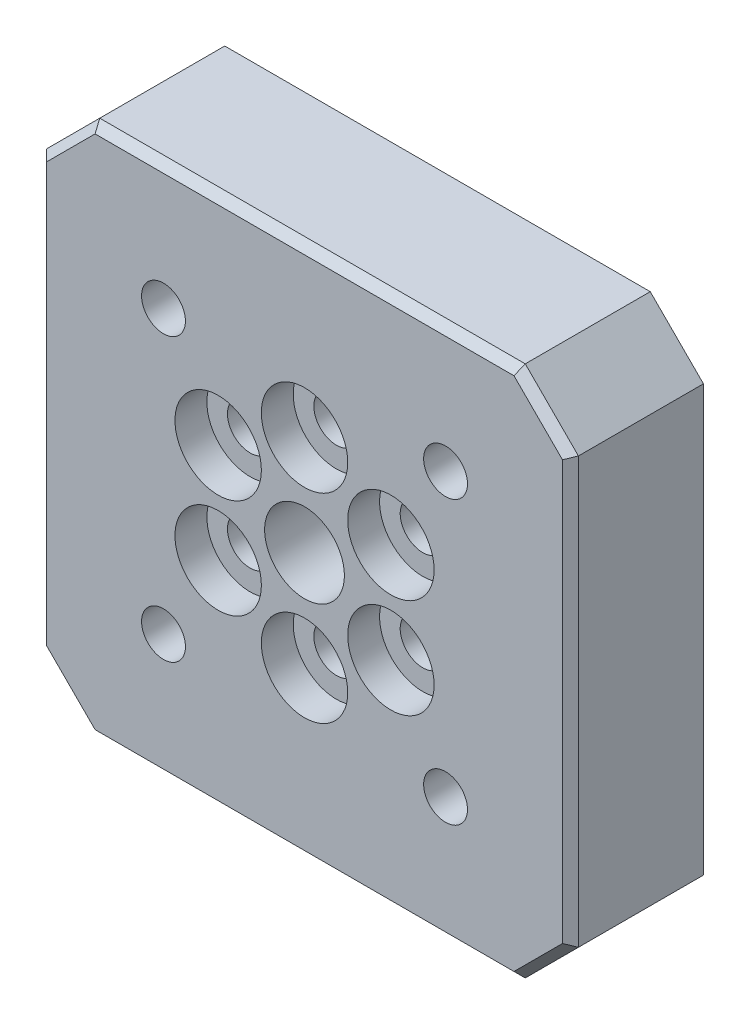
ISO-10303-21;
HEADER;
FILE_DESCRIPTION(('STEP AP214'),'2;1');
FILE_NAME('part.step','',(''),(''),'','','');
FILE_SCHEMA(('AUTOMOTIVE_DESIGN { 1 0 10303 214 1 1 1 1 }'));
ENDSEC;
DATA;
#1=APPLICATION_CONTEXT('core data for automotive mechanical design processes');
#2=APPLICATION_PROTOCOL_DEFINITION('international standard','automotive_design',2000,#1);
#3=PRODUCT_CONTEXT('',#1,'mechanical');
#4=PRODUCT('Part','Part','',(#3));
#5=PRODUCT_RELATED_PRODUCT_CATEGORY('part','',(#4));
#6=PRODUCT_DEFINITION_FORMATION('','',#4);
#7=PRODUCT_DEFINITION_CONTEXT('part definition',#1,'design');
#8=PRODUCT_DEFINITION('design','',#6,#7);
#9=PRODUCT_DEFINITION_SHAPE('','',#8);
#10=(LENGTH_UNIT() NAMED_UNIT(*) SI_UNIT(.MILLI.,.METRE.));
#11=(NAMED_UNIT(*) PLANE_ANGLE_UNIT() SI_UNIT($,.RADIAN.));
#12=(NAMED_UNIT(*) SI_UNIT($,.STERADIAN.) SOLID_ANGLE_UNIT());
#13=UNCERTAINTY_MEASURE_WITH_UNIT(LENGTH_MEASURE(1.E-05),#10,'distance_accuracy_value','');
#14=(GEOMETRIC_REPRESENTATION_CONTEXT(3) GLOBAL_UNCERTAINTY_ASSIGNED_CONTEXT((#13)) GLOBAL_UNIT_ASSIGNED_CONTEXT((#10,
#11,#12)) REPRESENTATION_CONTEXT('',''));
#15=CARTESIAN_POINT('',(0.,0.,0.));
#16=DIRECTION('',(0.,0.,1.));
#17=DIRECTION('',(1.,0.,0.));
#18=AXIS2_PLACEMENT_3D('',#15,#16,#17);
#19=CARTESIAN_POINT('',(0.,0.,10.));
#20=DIRECTION('',(1.,0.,0.));
#21=DIRECTION('',(0.,0.,-1.));
#22=AXIS2_PLACEMENT_3D('',#19,#20,#21);
#23=PLANE('',#22);
#24=DIRECTION('',(0.,0.,1.));
#25=VECTOR('',#24,1.);
#26=CARTESIAN_POINT('',(0.,4.00000000000002,10.));
#27=LINE('',#26,#25);
#28=CARTESIAN_POINT('',(0.,4.00000000000002,0.));
#29=VERTEX_POINT('',#28);
#30=CARTESIAN_POINT('',(0.,4.00000000000002,9.4));
#31=VERTEX_POINT('',#30);
#32=EDGE_CURVE('E204',#29,#31,#27,.T.);
#33=ORIENTED_EDGE('',*,*,#32,.T.);
#34=DIRECTION('',(0.,1.,0.));
#35=VECTOR('',#34,1.);
#36=CARTESIAN_POINT('',(0.,0.,9.4));
#37=LINE('',#36,#35);
#38=CARTESIAN_POINT('',(0.,36.,9.4));
#39=VERTEX_POINT('',#38);
#40=EDGE_CURVE('E73',#31,#39,#37,.T.);
#41=ORIENTED_EDGE('',*,*,#40,.T.);
#42=DIRECTION('',(0.,0.,-1.));
#43=VECTOR('',#42,1.);
#44=CARTESIAN_POINT('',(0.,36.,10.));
#45=LINE('',#44,#43);
#46=CARTESIAN_POINT('',(0.,36.,0.));
#47=VERTEX_POINT('',#46);
#48=EDGE_CURVE('E201',#39,#47,#45,.T.);
#49=ORIENTED_EDGE('',*,*,#48,.T.);
#50=DIRECTION('',(0.,-1.,0.));
#51=VECTOR('',#50,1.);
#52=CARTESIAN_POINT('',(0.,0.,0.));
#53=LINE('',#52,#51);
#54=EDGE_CURVE('E178',#47,#29,#53,.T.);
#55=ORIENTED_EDGE('',*,*,#54,.T.);
#56=EDGE_LOOP('',(#33,#41,#49,#55));
#57=FACE_BOUND('',#56,.T.);
#58=ADVANCED_FACE('F47',(#57),#23,.F.);
#59=CARTESIAN_POINT('',(0.,0.,10.));
#60=DIRECTION('',(0.,1.,0.));
#61=DIRECTION('',(0.,0.,1.));
#62=AXIS2_PLACEMENT_3D('',#59,#60,#61);
#63=PLANE('',#62);
#64=DIRECTION('',(0.,0.,1.));
#65=VECTOR('',#64,1.);
#66=CARTESIAN_POINT('',(36.,0.,10.));
#67=LINE('',#66,#65);
#68=CARTESIAN_POINT('',(36.,0.,0.));
#69=VERTEX_POINT('',#68);
#70=CARTESIAN_POINT('',(36.,0.,9.4));
#71=VERTEX_POINT('',#70);
#72=EDGE_CURVE('E159',#69,#71,#67,.T.);
#73=ORIENTED_EDGE('',*,*,#72,.T.);
#74=DIRECTION('',(-1.,0.,0.));
#75=VECTOR('',#74,1.);
#76=CARTESIAN_POINT('',(0.,0.,9.4));
#77=LINE('',#76,#75);
#78=CARTESIAN_POINT('',(4.,0.,9.4));
#79=VERTEX_POINT('',#78);
#80=EDGE_CURVE('E240',#71,#79,#77,.T.);
#81=ORIENTED_EDGE('',*,*,#80,.T.);
#82=DIRECTION('',(0.,0.,-1.));
#83=VECTOR('',#82,1.);
#84=CARTESIAN_POINT('',(4.,0.,10.));
#85=LINE('',#84,#83);
#86=CARTESIAN_POINT('',(4.,0.,0.));
#87=VERTEX_POINT('',#86);
#88=EDGE_CURVE('E164',#79,#87,#85,.T.);
#89=ORIENTED_EDGE('',*,*,#88,.T.);
#90=DIRECTION('',(1.,0.,0.));
#91=VECTOR('',#90,1.);
#92=CARTESIAN_POINT('',(0.,0.,0.));
#93=LINE('',#92,#91);
#94=EDGE_CURVE('E172',#87,#69,#93,.T.);
#95=ORIENTED_EDGE('',*,*,#94,.T.);
#96=EDGE_LOOP('',(#73,#81,#89,#95));
#97=FACE_BOUND('',#96,.T.);
#98=ADVANCED_FACE('F468',(#97),#63,.F.);
#99=CARTESIAN_POINT('',(40.,0.,10.));
#100=DIRECTION('',(-1.,0.,0.));
#101=DIRECTION('',(0.,0.,1.));
#102=AXIS2_PLACEMENT_3D('',#99,#100,#101);
#103=PLANE('',#102);
#104=DIRECTION('',(0.,0.,1.));
#105=VECTOR('',#104,1.);
#106=CARTESIAN_POINT('',(40.,36.,10.));
#107=LINE('',#106,#105);
#108=CARTESIAN_POINT('',(40.,36.,0.));
#109=VERTEX_POINT('',#108);
#110=CARTESIAN_POINT('',(40.,36.,9.4));
#111=VERTEX_POINT('',#110);
#112=EDGE_CURVE('E153',#109,#111,#107,.T.);
#113=ORIENTED_EDGE('',*,*,#112,.T.);
#114=DIRECTION('',(0.,-1.,0.));
#115=VECTOR('',#114,1.);
#116=CARTESIAN_POINT('',(40.,0.,9.4));
#117=LINE('',#116,#115);
#118=CARTESIAN_POINT('',(40.,4.,9.4));
#119=VERTEX_POINT('',#118);
#120=EDGE_CURVE('E149',#111,#119,#117,.T.);
#121=ORIENTED_EDGE('',*,*,#120,.T.);
#122=DIRECTION('',(0.,0.,-1.));
#123=VECTOR('',#122,1.);
#124=CARTESIAN_POINT('',(40.,4.,10.));
#125=LINE('',#124,#123);
#126=CARTESIAN_POINT('',(40.,4.,0.));
#127=VERTEX_POINT('',#126);
#128=EDGE_CURVE('E141',#119,#127,#125,.T.);
#129=ORIENTED_EDGE('',*,*,#128,.T.);
#130=DIRECTION('',(0.,1.,0.));
#131=VECTOR('',#130,1.);
#132=CARTESIAN_POINT('',(40.,0.,0.));
#133=LINE('',#132,#131);
#134=EDGE_CURVE('E146',#127,#109,#133,.T.);
#135=ORIENTED_EDGE('',*,*,#134,.T.);
#136=EDGE_LOOP('',(#113,#121,#129,#135));
#137=FACE_BOUND('',#136,.T.);
#138=ADVANCED_FACE('F144',(#137),#103,.F.);
#139=CARTESIAN_POINT('',(0.,40.,10.));
#140=DIRECTION('',(0.,-1.,0.));
#141=DIRECTION('',(0.,0.,-1.));
#142=AXIS2_PLACEMENT_3D('',#139,#140,#141);
#143=PLANE('',#142);
#144=DIRECTION('',(0.,0.,1.));
#145=VECTOR('',#144,1.);
#146=CARTESIAN_POINT('',(4.00000000000002,40.,10.));
#147=LINE('',#146,#145);
#148=CARTESIAN_POINT('',(4.00000000000002,40.,0.));
#149=VERTEX_POINT('',#148);
#150=CARTESIAN_POINT('',(4.00000000000002,40.,9.4));
#151=VERTEX_POINT('',#150);
#152=EDGE_CURVE('E195',#149,#151,#147,.T.);
#153=ORIENTED_EDGE('',*,*,#152,.T.);
#154=DIRECTION('',(1.,0.,0.));
#155=VECTOR('',#154,1.);
#156=CARTESIAN_POINT('',(0.,40.,9.4));
#157=LINE('',#156,#155);
#158=CARTESIAN_POINT('',(36.,40.,9.4));
#159=VERTEX_POINT('',#158);
#160=EDGE_CURVE('E11',#151,#159,#157,.T.);
#161=ORIENTED_EDGE('',*,*,#160,.T.);
#162=DIRECTION('',(0.,0.,-1.));
#163=VECTOR('',#162,1.);
#164=CARTESIAN_POINT('',(36.,40.,10.));
#165=LINE('',#164,#163);
#166=CARTESIAN_POINT('',(36.,40.,0.));
#167=VERTEX_POINT('',#166);
#168=EDGE_CURVE('E198',#159,#167,#165,.T.);
#169=ORIENTED_EDGE('',*,*,#168,.T.);
#170=DIRECTION('',(-1.,0.,0.));
#171=VECTOR('',#170,1.);
#172=CARTESIAN_POINT('',(0.,40.,0.));
#173=LINE('',#172,#171);
#174=EDGE_CURVE('E171',#167,#149,#173,.T.);
#175=ORIENTED_EDGE('',*,*,#174,.T.);
#176=EDGE_LOOP('',(#153,#161,#169,#175));
#177=FACE_BOUND('',#176,.T.);
#178=ADVANCED_FACE('F454',(#177),#143,.F.);
#179=CARTESIAN_POINT('',(0.,0.,10.));
#180=DIRECTION('',(0.,0.,-1.));
#181=DIRECTION('',(-1.,0.,0.));
#182=AXIS2_PLACEMENT_3D('',#179,#180,#181);
#183=PLANE('',#182);
#184=DIRECTION('',(0.707106781186549,0.707106781186546,0.));
#185=VECTOR('',#184,1.);
#186=CARTESIAN_POINT('',(39.5757359312881,4.42426406871193,10.));
#187=LINE('',#186,#185);
#188=CARTESIAN_POINT('',(35.7514718625761,0.599999999999996,10.));
#189=VERTEX_POINT('',#188);
#190=CARTESIAN_POINT('',(39.4,4.24852813742385,10.));
#191=VERTEX_POINT('',#190);
#192=EDGE_CURVE('E222',#189,#191,#187,.T.);
#193=ORIENTED_EDGE('',*,*,#192,.T.);
#194=DIRECTION('',(0.,1.,0.));
#195=VECTOR('',#194,1.);
#196=CARTESIAN_POINT('',(39.4,0.,10.));
#197=LINE('',#196,#195);
#198=CARTESIAN_POINT('',(39.4,35.7514718625761,10.));
#199=VERTEX_POINT('',#198);
#200=EDGE_CURVE('E228',#191,#199,#197,.T.);
#201=ORIENTED_EDGE('',*,*,#200,.T.);
#202=DIRECTION('',(-0.707106781186547,0.707106781186548,0.));
#203=VECTOR('',#202,1.);
#204=CARTESIAN_POINT('',(35.5757359312881,39.5757359312881,10.));
#205=LINE('',#204,#203);
#206=CARTESIAN_POINT('',(35.7514718625762,39.4,10.));
#207=VERTEX_POINT('',#206);
#208=EDGE_CURVE('E225',#199,#207,#205,.T.);
#209=ORIENTED_EDGE('',*,*,#208,.T.);
#210=DIRECTION('',(-1.,0.,0.));
#211=VECTOR('',#210,1.);
#212=CARTESIAN_POINT('',(0.,39.4,10.));
#213=LINE('',#212,#211);
#214=CARTESIAN_POINT('',(4.24852813742388,39.4,10.));
#215=VERTEX_POINT('',#214);
#216=EDGE_CURVE('E207',#207,#215,#213,.T.);
#217=ORIENTED_EDGE('',*,*,#216,.T.);
#218=DIRECTION('',(-0.707106781186548,-0.707106781186547,0.));
#219=VECTOR('',#218,1.);
#220=CARTESIAN_POINT('',(0.424264068711929,35.5757359312881,10.));
#221=LINE('',#220,#219);
#222=CARTESIAN_POINT('',(0.599999999999995,35.7514718625761,10.));
#223=VERTEX_POINT('',#222);
#224=EDGE_CURVE('E210',#215,#223,#221,.T.);
#225=ORIENTED_EDGE('',*,*,#224,.T.);
#226=DIRECTION('',(0.,-1.,0.));
#227=VECTOR('',#226,1.);
#228=CARTESIAN_POINT('',(0.599999999999996,0.,10.));
#229=LINE('',#228,#227);
#230=CARTESIAN_POINT('',(0.599999999999996,4.24852813742387,10.));
#231=VERTEX_POINT('',#230);
#232=EDGE_CURVE('E213',#223,#231,#229,.T.);
#233=ORIENTED_EDGE('',*,*,#232,.T.);
#234=DIRECTION('',(0.707106781186546,-0.707106781186549,0.));
#235=VECTOR('',#234,1.);
#236=CARTESIAN_POINT('',(4.42426406871193,0.424264068711926,10.));
#237=LINE('',#236,#235);
#238=CARTESIAN_POINT('',(4.24852813742386,0.599999999999996,10.));
#239=VERTEX_POINT('',#238);
#240=EDGE_CURVE('E216',#231,#239,#237,.T.);
#241=ORIENTED_EDGE('',*,*,#240,.T.);
#242=DIRECTION('',(1.,0.,0.));
#243=VECTOR('',#242,1.);
#244=CARTESIAN_POINT('',(0.,0.599999999999996,10.));
#245=LINE('',#244,#243);
#246=EDGE_CURVE('E219',#239,#189,#245,.T.);
#247=ORIENTED_EDGE('',*,*,#246,.T.);
#248=EDGE_LOOP('',(#193,#201,#209,#217,#225,#233,#241,#247));
#249=FACE_BOUND('',#248,.T.);
#250=CARTESIAN_POINT('',(9.39339828220179,30.6066017177982,10.));
#251=DIRECTION('',(0.,0.,1.));
#252=DIRECTION('',(1.,0.,0.));
#253=AXIS2_PLACEMENT_3D('',#250,#251,#252);
#254=CIRCLE('',#253,1.65);
#255=CARTESIAN_POINT('',(11.0433982822018,30.6066017177982,10.));
#256=VERTEX_POINT('',#255);
#257=EDGE_CURVE('E279',#256,#256,#254,.T.);
#258=ORIENTED_EDGE('',*,*,#257,.F.);
#259=EDGE_LOOP('',(#258));
#260=FACE_BOUND('',#259,.T.);
#261=CARTESIAN_POINT('',(30.6066017177987,30.6066017177987,10.));
#262=DIRECTION('',(0.,0.,1.));
#263=DIRECTION('',(1.,0.,0.));
#264=AXIS2_PLACEMENT_3D('',#261,#262,#263);
#265=CIRCLE('',#264,1.65);
#266=CARTESIAN_POINT('',(32.2566017177987,30.6066017177987,10.));
#267=VERTEX_POINT('',#266);
#268=EDGE_CURVE('E292',#267,#267,#265,.T.);
#269=ORIENTED_EDGE('',*,*,#268,.F.);
#270=EDGE_LOOP('',(#269));
#271=FACE_BOUND('',#270,.T.);
#272=CARTESIAN_POINT('',(30.6066017177991,9.39339828220179,10.));
#273=DIRECTION('',(0.,0.,1.));
#274=DIRECTION('',(1.,0.,0.));
#275=AXIS2_PLACEMENT_3D('',#272,#273,#274);
#276=CIRCLE('',#275,1.65);
#277=CARTESIAN_POINT('',(32.2566017177991,9.39339828220179,10.));
#278=VERTEX_POINT('',#277);
#279=EDGE_CURVE('E302',#278,#278,#276,.T.);
#280=ORIENTED_EDGE('',*,*,#279,.F.);
#281=EDGE_LOOP('',(#280));
#282=FACE_BOUND('',#281,.T.);
#283=CARTESIAN_POINT('',(9.39339828220225,9.39339828220133,10.));
#284=DIRECTION('',(0.,0.,1.));
#285=DIRECTION('',(1.,0.,0.));
#286=AXIS2_PLACEMENT_3D('',#283,#284,#285);
#287=CIRCLE('',#286,1.65);
#288=CARTESIAN_POINT('',(11.0433982822022,9.39339828220133,10.));
#289=VERTEX_POINT('',#288);
#290=EDGE_CURVE('E310',#289,#289,#287,.T.);
#291=ORIENTED_EDGE('',*,*,#290,.F.);
#292=EDGE_LOOP('',(#291));
#293=FACE_BOUND('',#292,.T.);
#294=CARTESIAN_POINT('',(20.,27.5,10.));
#295=DIRECTION('',(0.,0.,1.));
#296=DIRECTION('',(1.,0.,0.));
#297=AXIS2_PLACEMENT_3D('',#294,#295,#296);
#298=CIRCLE('',#297,3.25);
#299=CARTESIAN_POINT('',(23.25,27.5,10.));
#300=VERTEX_POINT('',#299);
#301=EDGE_CURVE('E318',#300,#300,#298,.T.);
#302=ORIENTED_EDGE('',*,*,#301,.F.);
#303=EDGE_LOOP('',(#302));
#304=FACE_BOUND('',#303,.T.);
#305=CARTESIAN_POINT('',(26.4951905283833,23.75,10.));
#306=DIRECTION('',(0.,0.,1.));
#307=DIRECTION('',(1.,0.,0.));
#308=AXIS2_PLACEMENT_3D('',#305,#306,#307);
#309=CIRCLE('',#308,3.25);
#310=CARTESIAN_POINT('',(29.7451905283833,23.75,10.));
#311=VERTEX_POINT('',#310);
#312=EDGE_CURVE('E334',#311,#311,#309,.T.);
#313=ORIENTED_EDGE('',*,*,#312,.F.);
#314=EDGE_LOOP('',(#313));
#315=FACE_BOUND('',#314,.T.);
#316=CARTESIAN_POINT('',(26.4951905283833,16.25,10.));
#317=DIRECTION('',(0.,0.,1.));
#318=DIRECTION('',(1.,0.,0.));
#319=AXIS2_PLACEMENT_3D('',#316,#317,#318);
#320=CIRCLE('',#319,3.25);
#321=CARTESIAN_POINT('',(29.7451905283833,16.25,10.));
#322=VERTEX_POINT('',#321);
#323=EDGE_CURVE('E350',#322,#322,#320,.T.);
#324=ORIENTED_EDGE('',*,*,#323,.F.);
#325=EDGE_LOOP('',(#324));
#326=FACE_BOUND('',#325,.T.);
#327=CARTESIAN_POINT('',(20.,12.5,10.));
#328=DIRECTION('',(0.,0.,1.));
#329=DIRECTION('',(1.,0.,0.));
#330=AXIS2_PLACEMENT_3D('',#327,#328,#329);
#331=CIRCLE('',#330,3.25);
#332=CARTESIAN_POINT('',(23.25,12.5,10.));
#333=VERTEX_POINT('',#332);
#334=EDGE_CURVE('E366',#333,#333,#331,.T.);
#335=ORIENTED_EDGE('',*,*,#334,.F.);
#336=EDGE_LOOP('',(#335));
#337=FACE_BOUND('',#336,.T.);
#338=CARTESIAN_POINT('',(13.5048094716167,16.25,10.));
#339=DIRECTION('',(0.,0.,1.));
#340=DIRECTION('',(1.,0.,0.));
#341=AXIS2_PLACEMENT_3D('',#338,#339,#340);
#342=CIRCLE('',#341,3.25);
#343=CARTESIAN_POINT('',(16.7548094716167,16.25,10.));
#344=VERTEX_POINT('',#343);
#345=EDGE_CURVE('E382',#344,#344,#342,.T.);
#346=ORIENTED_EDGE('',*,*,#345,.F.);
#347=EDGE_LOOP('',(#346));
#348=FACE_BOUND('',#347,.T.);
#349=CARTESIAN_POINT('',(13.5048094716167,23.75,10.));
#350=DIRECTION('',(0.,0.,1.));
#351=DIRECTION('',(1.,0.,0.));
#352=AXIS2_PLACEMENT_3D('',#349,#350,#351);
#353=CIRCLE('',#352,3.25);
#354=CARTESIAN_POINT('',(16.7548094716167,23.75,10.));
#355=VERTEX_POINT('',#354);
#356=EDGE_CURVE('E398',#355,#355,#353,.T.);
#357=ORIENTED_EDGE('',*,*,#356,.F.);
#358=EDGE_LOOP('',(#357));
#359=FACE_BOUND('',#358,.T.);
#360=CARTESIAN_POINT('',(20.,20.,10.));
#361=DIRECTION('',(0.,0.,1.));
#362=DIRECTION('',(1.,0.,0.));
#363=AXIS2_PLACEMENT_3D('',#360,#361,#362);
#364=CIRCLE('',#363,3.);
#365=CARTESIAN_POINT('',(23.,20.,10.));
#366=VERTEX_POINT('',#365);
#367=EDGE_CURVE('E414',#366,#366,#364,.T.);
#368=ORIENTED_EDGE('',*,*,#367,.F.);
#369=EDGE_LOOP('',(#368));
#370=FACE_BOUND('',#369,.T.);
#371=ADVANCED_FACE('F439',(#249,#260,#271,#282,#293,#304,#315,#326,#337,#348,#359,#370),#183,.F.);
#372=CARTESIAN_POINT('',(0.,0.,0.));
#373=DIRECTION('',(0.,0.,-1.));
#374=DIRECTION('',(-1.,0.,0.));
#375=AXIS2_PLACEMENT_3D('',#372,#373,#374);
#376=PLANE('',#375);
#377=CARTESIAN_POINT('',(9.39339828220179,30.6066017177982,0.));
#378=DIRECTION('',(0.,0.,1.));
#379=DIRECTION('',(1.,0.,0.));
#380=AXIS2_PLACEMENT_3D('',#377,#378,#379);
#381=CIRCLE('',#380,1.65);
#382=CARTESIAN_POINT('',(11.0433982822018,30.6066017177982,0.));
#383=VERTEX_POINT('',#382);
#384=EDGE_CURVE('E286',#383,#383,#381,.T.);
#385=ORIENTED_EDGE('',*,*,#384,.T.);
#386=EDGE_LOOP('',(#385));
#387=FACE_BOUND('',#386,.T.);
#388=CARTESIAN_POINT('',(30.6066017177987,30.6066017177987,0.));
#389=DIRECTION('',(0.,0.,1.));
#390=DIRECTION('',(1.,0.,0.));
#391=AXIS2_PLACEMENT_3D('',#388,#389,#390);
#392=CIRCLE('',#391,1.65);
#393=CARTESIAN_POINT('',(32.2566017177987,30.6066017177987,0.));
#394=VERTEX_POINT('',#393);
#395=EDGE_CURVE('E298',#394,#394,#392,.T.);
#396=ORIENTED_EDGE('',*,*,#395,.T.);
#397=EDGE_LOOP('',(#396));
#398=FACE_BOUND('',#397,.T.);
#399=CARTESIAN_POINT('',(30.6066017177991,9.39339828220179,0.));
#400=DIRECTION('',(0.,0.,1.));
#401=DIRECTION('',(1.,0.,0.));
#402=AXIS2_PLACEMENT_3D('',#399,#400,#401);
#403=CIRCLE('',#402,1.65);
#404=CARTESIAN_POINT('',(32.2566017177991,9.39339828220179,0.));
#405=VERTEX_POINT('',#404);
#406=EDGE_CURVE('E306',#405,#405,#403,.T.);
#407=ORIENTED_EDGE('',*,*,#406,.T.);
#408=EDGE_LOOP('',(#407));
#409=FACE_BOUND('',#408,.T.);
#410=CARTESIAN_POINT('',(9.39339828220225,9.39339828220133,0.));
#411=DIRECTION('',(0.,0.,1.));
#412=DIRECTION('',(1.,0.,0.));
#413=AXIS2_PLACEMENT_3D('',#410,#411,#412);
#414=CIRCLE('',#413,1.65);
#415=CARTESIAN_POINT('',(11.0433982822022,9.39339828220133,0.));
#416=VERTEX_POINT('',#415);
#417=EDGE_CURVE('E314',#416,#416,#414,.T.);
#418=ORIENTED_EDGE('',*,*,#417,.T.);
#419=EDGE_LOOP('',(#418));
#420=FACE_BOUND('',#419,.T.);
#421=CARTESIAN_POINT('',(20.,27.5,0.));
#422=DIRECTION('',(0.,0.,1.));
#423=DIRECTION('',(1.,0.,0.));
#424=AXIS2_PLACEMENT_3D('',#421,#422,#423);
#425=CIRCLE('',#424,1.7);
#426=CARTESIAN_POINT('',(21.7,27.5,0.));
#427=VERTEX_POINT('',#426);
#428=EDGE_CURVE('E330',#427,#427,#425,.T.);
#429=ORIENTED_EDGE('',*,*,#428,.T.);
#430=EDGE_LOOP('',(#429));
#431=FACE_BOUND('',#430,.T.);
#432=CARTESIAN_POINT('',(26.4951905283833,23.75,0.));
#433=DIRECTION('',(0.,0.,1.));
#434=DIRECTION('',(1.,0.,0.));
#435=AXIS2_PLACEMENT_3D('',#432,#433,#434);
#436=CIRCLE('',#435,1.7);
#437=CARTESIAN_POINT('',(28.1951905283833,23.75,0.));
#438=VERTEX_POINT('',#437);
#439=EDGE_CURVE('E346',#438,#438,#436,.T.);
#440=ORIENTED_EDGE('',*,*,#439,.T.);
#441=EDGE_LOOP('',(#440));
#442=FACE_BOUND('',#441,.T.);
#443=CARTESIAN_POINT('',(26.4951905283833,16.25,0.));
#444=DIRECTION('',(0.,0.,1.));
#445=DIRECTION('',(1.,0.,0.));
#446=AXIS2_PLACEMENT_3D('',#443,#444,#445);
#447=CIRCLE('',#446,1.7);
#448=CARTESIAN_POINT('',(28.1951905283833,16.25,0.));
#449=VERTEX_POINT('',#448);
#450=EDGE_CURVE('E362',#449,#449,#447,.T.);
#451=ORIENTED_EDGE('',*,*,#450,.T.);
#452=EDGE_LOOP('',(#451));
#453=FACE_BOUND('',#452,.T.);
#454=CARTESIAN_POINT('',(20.,12.5,0.));
#455=DIRECTION('',(0.,0.,1.));
#456=DIRECTION('',(1.,0.,0.));
#457=AXIS2_PLACEMENT_3D('',#454,#455,#456);
#458=CIRCLE('',#457,1.7);
#459=CARTESIAN_POINT('',(21.7,12.5,0.));
#460=VERTEX_POINT('',#459);
#461=EDGE_CURVE('E378',#460,#460,#458,.T.);
#462=ORIENTED_EDGE('',*,*,#461,.T.);
#463=EDGE_LOOP('',(#462));
#464=FACE_BOUND('',#463,.T.);
#465=CARTESIAN_POINT('',(13.5048094716167,16.25,0.));
#466=DIRECTION('',(0.,0.,1.));
#467=DIRECTION('',(1.,0.,0.));
#468=AXIS2_PLACEMENT_3D('',#465,#466,#467);
#469=CIRCLE('',#468,1.7);
#470=CARTESIAN_POINT('',(15.2048094716167,16.25,0.));
#471=VERTEX_POINT('',#470);
#472=EDGE_CURVE('E394',#471,#471,#469,.T.);
#473=ORIENTED_EDGE('',*,*,#472,.T.);
#474=EDGE_LOOP('',(#473));
#475=FACE_BOUND('',#474,.T.);
#476=CARTESIAN_POINT('',(13.5048094716167,23.75,0.));
#477=DIRECTION('',(0.,0.,1.));
#478=DIRECTION('',(1.,0.,0.));
#479=AXIS2_PLACEMENT_3D('',#476,#477,#478);
#480=CIRCLE('',#479,1.7);
#481=CARTESIAN_POINT('',(15.2048094716167,23.75,0.));
#482=VERTEX_POINT('',#481);
#483=EDGE_CURVE('E410',#482,#482,#480,.T.);
#484=ORIENTED_EDGE('',*,*,#483,.T.);
#485=EDGE_LOOP('',(#484));
#486=FACE_BOUND('',#485,.T.);
#487=CARTESIAN_POINT('',(20.,20.,0.));
#488=DIRECTION('',(0.,0.,1.));
#489=DIRECTION('',(1.,0.,0.));
#490=AXIS2_PLACEMENT_3D('',#487,#488,#489);
#491=CIRCLE('',#490,3.);
#492=CARTESIAN_POINT('',(23.,20.,0.));
#493=VERTEX_POINT('',#492);
#494=EDGE_CURVE('E418',#493,#493,#491,.T.);
#495=ORIENTED_EDGE('',*,*,#494,.T.);
#496=EDGE_LOOP('',(#495));
#497=FACE_BOUND('',#496,.T.);
#498=ORIENTED_EDGE('',*,*,#134,.F.);
#499=DIRECTION('',(0.707106781186549,0.707106781186546,0.));
#500=VECTOR('',#499,1.);
#501=CARTESIAN_POINT('',(17.9999999999999,-18.,0.));
#502=LINE('',#501,#500);
#503=EDGE_CURVE('E156',#127,#69,#502,.F.);
#504=ORIENTED_EDGE('',*,*,#503,.T.);
#505=ORIENTED_EDGE('',*,*,#94,.F.);
#506=DIRECTION('',(0.707106781186546,-0.707106781186549,0.));
#507=VECTOR('',#506,1.);
#508=CARTESIAN_POINT('',(2.00000000000001,2.,0.));
#509=LINE('',#508,#507);
#510=EDGE_CURVE('E186',#87,#29,#509,.F.);
#511=ORIENTED_EDGE('',*,*,#510,.T.);
#512=ORIENTED_EDGE('',*,*,#54,.F.);
#513=DIRECTION('',(-0.707106781186548,-0.707106781186547,0.));
#514=VECTOR('',#513,1.);
#515=CARTESIAN_POINT('',(-18.,18.,0.));
#516=LINE('',#515,#514);
#517=EDGE_CURVE('E152',#47,#149,#516,.F.);
#518=ORIENTED_EDGE('',*,*,#517,.T.);
#519=ORIENTED_EDGE('',*,*,#174,.F.);
#520=DIRECTION('',(-0.707106781186547,0.707106781186548,0.));
#521=VECTOR('',#520,1.);
#522=CARTESIAN_POINT('',(38.,38.,0.));
#523=LINE('',#522,#521);
#524=EDGE_CURVE('E165',#167,#109,#523,.F.);
#525=ORIENTED_EDGE('',*,*,#524,.T.);
#526=EDGE_LOOP('',(#498,#504,#505,#511,#512,#518,#519,#525));
#527=FACE_BOUND('',#526,.T.);
#528=ADVANCED_FACE('F167',(#387,#398,#409,#420,#431,#442,#453,#464,#475,#486,#497,#527),#376,.T.);
#529=CARTESIAN_POINT('',(20.,20.,10.));
#530=DIRECTION('',(0.,0.,1.));
#531=DIRECTION('',(1.,0.,0.));
#532=AXIS2_PLACEMENT_3D('',#529,#530,#531);
#533=CYLINDRICAL_SURFACE('',#532,3.);
#534=ORIENTED_EDGE('',*,*,#494,.F.);
#535=EDGE_LOOP('',(#534));
#536=FACE_BOUND('',#535,.T.);
#537=ORIENTED_EDGE('',*,*,#367,.T.);
#538=EDGE_LOOP('',(#537));
#539=FACE_BOUND('',#538,.T.);
#540=ADVANCED_FACE('F797',(#536,#539),#533,.F.);
#541=CARTESIAN_POINT('',(13.5048094716167,23.75,10.));
#542=DIRECTION('',(0.,0.,1.));
#543=DIRECTION('',(1.,0.,0.));
#544=AXIS2_PLACEMENT_3D('',#541,#542,#543);
#545=CYLINDRICAL_SURFACE('',#544,1.7);
#546=ORIENTED_EDGE('',*,*,#483,.F.);
#547=EDGE_LOOP('',(#546));
#548=FACE_BOUND('',#547,.T.);
#549=CARTESIAN_POINT('',(13.5048094716167,23.75,7.6));
#550=DIRECTION('',(0.,0.,1.));
#551=DIRECTION('',(1.,0.,0.));
#552=AXIS2_PLACEMENT_3D('',#549,#550,#551);
#553=CIRCLE('',#552,1.7);
#554=CARTESIAN_POINT('',(15.2048094716167,23.75,7.6));
#555=VERTEX_POINT('',#554);
#556=EDGE_CURVE('E406',#555,#555,#553,.T.);
#557=ORIENTED_EDGE('',*,*,#556,.T.);
#558=EDGE_LOOP('',(#557));
#559=FACE_BOUND('',#558,.T.);
#560=ADVANCED_FACE('F787',(#548,#559),#545,.F.);
#561=CARTESIAN_POINT('',(15.2048094716167,23.75,7.6));
#562=DIRECTION('',(0.,0.,-1.));
#563=DIRECTION('',(-1.,0.,0.));
#564=AXIS2_PLACEMENT_3D('',#561,#562,#563);
#565=PLANE('',#564);
#566=ORIENTED_EDGE('',*,*,#556,.F.);
#567=EDGE_LOOP('',(#566));
#568=FACE_BOUND('',#567,.T.);
#569=CARTESIAN_POINT('',(13.5048094716167,23.75,7.6));
#570=DIRECTION('',(0.,0.,1.));
#571=DIRECTION('',(1.,0.,0.));
#572=AXIS2_PLACEMENT_3D('',#569,#570,#571);
#573=CIRCLE('',#572,3.25);
#574=CARTESIAN_POINT('',(16.7548094716167,23.75,7.6));
#575=VERTEX_POINT('',#574);
#576=EDGE_CURVE('E402',#575,#575,#573,.T.);
#577=ORIENTED_EDGE('',*,*,#576,.T.);
#578=EDGE_LOOP('',(#577));
#579=FACE_BOUND('',#578,.T.);
#580=ADVANCED_FACE('F777',(#568,#579),#565,.F.);
#581=CARTESIAN_POINT('',(13.5048094716167,23.75,10.));
#582=DIRECTION('',(0.,0.,1.));
#583=DIRECTION('',(1.,0.,0.));
#584=AXIS2_PLACEMENT_3D('',#581,#582,#583);
#585=CYLINDRICAL_SURFACE('',#584,3.25);
#586=ORIENTED_EDGE('',*,*,#576,.F.);
#587=EDGE_LOOP('',(#586));
#588=FACE_BOUND('',#587,.T.);
#589=ORIENTED_EDGE('',*,*,#356,.T.);
#590=EDGE_LOOP('',(#589));
#591=FACE_BOUND('',#590,.T.);
#592=ADVANCED_FACE('F767',(#588,#591),#585,.F.);
#593=CARTESIAN_POINT('',(13.5048094716167,16.25,10.));
#594=DIRECTION('',(0.,0.,1.));
#595=DIRECTION('',(1.,0.,0.));
#596=AXIS2_PLACEMENT_3D('',#593,#594,#595);
#597=CYLINDRICAL_SURFACE('',#596,1.7);
#598=ORIENTED_EDGE('',*,*,#472,.F.);
#599=EDGE_LOOP('',(#598));
#600=FACE_BOUND('',#599,.T.);
#601=CARTESIAN_POINT('',(13.5048094716167,16.25,7.6));
#602=DIRECTION('',(0.,0.,1.));
#603=DIRECTION('',(1.,0.,0.));
#604=AXIS2_PLACEMENT_3D('',#601,#602,#603);
#605=CIRCLE('',#604,1.7);
#606=CARTESIAN_POINT('',(15.2048094716167,16.25,7.6));
#607=VERTEX_POINT('',#606);
#608=EDGE_CURVE('E390',#607,#607,#605,.T.);
#609=ORIENTED_EDGE('',*,*,#608,.T.);
#610=EDGE_LOOP('',(#609));
#611=FACE_BOUND('',#610,.T.);
#612=ADVANCED_FACE('F757',(#600,#611),#597,.F.);
#613=CARTESIAN_POINT('',(15.2048094716167,16.25,7.6));
#614=DIRECTION('',(0.,0.,-1.));
#615=DIRECTION('',(-1.,0.,0.));
#616=AXIS2_PLACEMENT_3D('',#613,#614,#615);
#617=PLANE('',#616);
#618=ORIENTED_EDGE('',*,*,#608,.F.);
#619=EDGE_LOOP('',(#618));
#620=FACE_BOUND('',#619,.T.);
#621=CARTESIAN_POINT('',(13.5048094716167,16.25,7.6));
#622=DIRECTION('',(0.,0.,1.));
#623=DIRECTION('',(1.,0.,0.));
#624=AXIS2_PLACEMENT_3D('',#621,#622,#623);
#625=CIRCLE('',#624,3.25);
#626=CARTESIAN_POINT('',(16.7548094716167,16.25,7.6));
#627=VERTEX_POINT('',#626);
#628=EDGE_CURVE('E386',#627,#627,#625,.T.);
#629=ORIENTED_EDGE('',*,*,#628,.T.);
#630=EDGE_LOOP('',(#629));
#631=FACE_BOUND('',#630,.T.);
#632=ADVANCED_FACE('F747',(#620,#631),#617,.F.);
#633=CARTESIAN_POINT('',(13.5048094716167,16.25,10.));
#634=DIRECTION('',(0.,0.,1.));
#635=DIRECTION('',(1.,0.,0.));
#636=AXIS2_PLACEMENT_3D('',#633,#634,#635);
#637=CYLINDRICAL_SURFACE('',#636,3.25);
#638=ORIENTED_EDGE('',*,*,#628,.F.);
#639=EDGE_LOOP('',(#638));
#640=FACE_BOUND('',#639,.T.);
#641=ORIENTED_EDGE('',*,*,#345,.T.);
#642=EDGE_LOOP('',(#641));
#643=FACE_BOUND('',#642,.T.);
#644=ADVANCED_FACE('F737',(#640,#643),#637,.F.);
#645=CARTESIAN_POINT('',(20.,12.5,10.));
#646=DIRECTION('',(0.,0.,1.));
#647=DIRECTION('',(1.,0.,0.));
#648=AXIS2_PLACEMENT_3D('',#645,#646,#647);
#649=CYLINDRICAL_SURFACE('',#648,1.7);
#650=ORIENTED_EDGE('',*,*,#461,.F.);
#651=EDGE_LOOP('',(#650));
#652=FACE_BOUND('',#651,.T.);
#653=CARTESIAN_POINT('',(20.,12.5,7.6));
#654=DIRECTION('',(0.,0.,1.));
#655=DIRECTION('',(1.,0.,0.));
#656=AXIS2_PLACEMENT_3D('',#653,#654,#655);
#657=CIRCLE('',#656,1.7);
#658=CARTESIAN_POINT('',(21.7,12.5,7.6));
#659=VERTEX_POINT('',#658);
#660=EDGE_CURVE('E374',#659,#659,#657,.T.);
#661=ORIENTED_EDGE('',*,*,#660,.T.);
#662=EDGE_LOOP('',(#661));
#663=FACE_BOUND('',#662,.T.);
#664=ADVANCED_FACE('F727',(#652,#663),#649,.F.);
#665=CARTESIAN_POINT('',(21.7,12.5,7.6));
#666=DIRECTION('',(0.,0.,-1.));
#667=DIRECTION('',(-1.,0.,0.));
#668=AXIS2_PLACEMENT_3D('',#665,#666,#667);
#669=PLANE('',#668);
#670=ORIENTED_EDGE('',*,*,#660,.F.);
#671=EDGE_LOOP('',(#670));
#672=FACE_BOUND('',#671,.T.);
#673=CARTESIAN_POINT('',(20.,12.5,7.6));
#674=DIRECTION('',(0.,0.,1.));
#675=DIRECTION('',(1.,0.,0.));
#676=AXIS2_PLACEMENT_3D('',#673,#674,#675);
#677=CIRCLE('',#676,3.25);
#678=CARTESIAN_POINT('',(23.25,12.5,7.6));
#679=VERTEX_POINT('',#678);
#680=EDGE_CURVE('E370',#679,#679,#677,.T.);
#681=ORIENTED_EDGE('',*,*,#680,.T.);
#682=EDGE_LOOP('',(#681));
#683=FACE_BOUND('',#682,.T.);
#684=ADVANCED_FACE('F717',(#672,#683),#669,.F.);
#685=CARTESIAN_POINT('',(20.,12.5,10.));
#686=DIRECTION('',(0.,0.,1.));
#687=DIRECTION('',(1.,0.,0.));
#688=AXIS2_PLACEMENT_3D('',#685,#686,#687);
#689=CYLINDRICAL_SURFACE('',#688,3.25);
#690=ORIENTED_EDGE('',*,*,#680,.F.);
#691=EDGE_LOOP('',(#690));
#692=FACE_BOUND('',#691,.T.);
#693=ORIENTED_EDGE('',*,*,#334,.T.);
#694=EDGE_LOOP('',(#693));
#695=FACE_BOUND('',#694,.T.);
#696=ADVANCED_FACE('F707',(#692,#695),#689,.F.);
#697=CARTESIAN_POINT('',(26.4951905283833,16.25,10.));
#698=DIRECTION('',(0.,0.,1.));
#699=DIRECTION('',(1.,0.,0.));
#700=AXIS2_PLACEMENT_3D('',#697,#698,#699);
#701=CYLINDRICAL_SURFACE('',#700,1.7);
#702=ORIENTED_EDGE('',*,*,#450,.F.);
#703=EDGE_LOOP('',(#702));
#704=FACE_BOUND('',#703,.T.);
#705=CARTESIAN_POINT('',(26.4951905283833,16.25,7.6));
#706=DIRECTION('',(0.,0.,1.));
#707=DIRECTION('',(1.,0.,0.));
#708=AXIS2_PLACEMENT_3D('',#705,#706,#707);
#709=CIRCLE('',#708,1.7);
#710=CARTESIAN_POINT('',(28.1951905283833,16.25,7.6));
#711=VERTEX_POINT('',#710);
#712=EDGE_CURVE('E358',#711,#711,#709,.T.);
#713=ORIENTED_EDGE('',*,*,#712,.T.);
#714=EDGE_LOOP('',(#713));
#715=FACE_BOUND('',#714,.T.);
#716=ADVANCED_FACE('F697',(#704,#715),#701,.F.);
#717=CARTESIAN_POINT('',(28.1951905283833,16.25,7.6));
#718=DIRECTION('',(0.,0.,-1.));
#719=DIRECTION('',(-1.,0.,0.));
#720=AXIS2_PLACEMENT_3D('',#717,#718,#719);
#721=PLANE('',#720);
#722=ORIENTED_EDGE('',*,*,#712,.F.);
#723=EDGE_LOOP('',(#722));
#724=FACE_BOUND('',#723,.T.);
#725=CARTESIAN_POINT('',(26.4951905283833,16.25,7.6));
#726=DIRECTION('',(0.,0.,1.));
#727=DIRECTION('',(1.,0.,0.));
#728=AXIS2_PLACEMENT_3D('',#725,#726,#727);
#729=CIRCLE('',#728,3.25);
#730=CARTESIAN_POINT('',(29.7451905283833,16.25,7.6));
#731=VERTEX_POINT('',#730);
#732=EDGE_CURVE('E354',#731,#731,#729,.T.);
#733=ORIENTED_EDGE('',*,*,#732,.T.);
#734=EDGE_LOOP('',(#733));
#735=FACE_BOUND('',#734,.T.);
#736=ADVANCED_FACE('F687',(#724,#735),#721,.F.);
#737=CARTESIAN_POINT('',(26.4951905283833,16.25,10.));
#738=DIRECTION('',(0.,0.,1.));
#739=DIRECTION('',(1.,0.,0.));
#740=AXIS2_PLACEMENT_3D('',#737,#738,#739);
#741=CYLINDRICAL_SURFACE('',#740,3.25);
#742=ORIENTED_EDGE('',*,*,#732,.F.);
#743=EDGE_LOOP('',(#742));
#744=FACE_BOUND('',#743,.T.);
#745=ORIENTED_EDGE('',*,*,#323,.T.);
#746=EDGE_LOOP('',(#745));
#747=FACE_BOUND('',#746,.T.);
#748=ADVANCED_FACE('F677',(#744,#747),#741,.F.);
#749=CARTESIAN_POINT('',(26.4951905283833,23.75,10.));
#750=DIRECTION('',(0.,0.,1.));
#751=DIRECTION('',(1.,0.,0.));
#752=AXIS2_PLACEMENT_3D('',#749,#750,#751);
#753=CYLINDRICAL_SURFACE('',#752,1.7);
#754=ORIENTED_EDGE('',*,*,#439,.F.);
#755=EDGE_LOOP('',(#754));
#756=FACE_BOUND('',#755,.T.);
#757=CARTESIAN_POINT('',(26.4951905283833,23.75,7.6));
#758=DIRECTION('',(0.,0.,1.));
#759=DIRECTION('',(1.,0.,0.));
#760=AXIS2_PLACEMENT_3D('',#757,#758,#759);
#761=CIRCLE('',#760,1.7);
#762=CARTESIAN_POINT('',(28.1951905283833,23.75,7.6));
#763=VERTEX_POINT('',#762);
#764=EDGE_CURVE('E342',#763,#763,#761,.T.);
#765=ORIENTED_EDGE('',*,*,#764,.T.);
#766=EDGE_LOOP('',(#765));
#767=FACE_BOUND('',#766,.T.);
#768=ADVANCED_FACE('F667',(#756,#767),#753,.F.);
#769=CARTESIAN_POINT('',(28.1951905283833,23.75,7.6));
#770=DIRECTION('',(0.,0.,-1.));
#771=DIRECTION('',(-1.,0.,0.));
#772=AXIS2_PLACEMENT_3D('',#769,#770,#771);
#773=PLANE('',#772);
#774=ORIENTED_EDGE('',*,*,#764,.F.);
#775=EDGE_LOOP('',(#774));
#776=FACE_BOUND('',#775,.T.);
#777=CARTESIAN_POINT('',(26.4951905283833,23.75,7.6));
#778=DIRECTION('',(0.,0.,1.));
#779=DIRECTION('',(1.,0.,0.));
#780=AXIS2_PLACEMENT_3D('',#777,#778,#779);
#781=CIRCLE('',#780,3.25);
#782=CARTESIAN_POINT('',(29.7451905283833,23.75,7.6));
#783=VERTEX_POINT('',#782);
#784=EDGE_CURVE('E338',#783,#783,#781,.T.);
#785=ORIENTED_EDGE('',*,*,#784,.T.);
#786=EDGE_LOOP('',(#785));
#787=FACE_BOUND('',#786,.T.);
#788=ADVANCED_FACE('F657',(#776,#787),#773,.F.);
#789=CARTESIAN_POINT('',(26.4951905283833,23.75,10.));
#790=DIRECTION('',(0.,0.,1.));
#791=DIRECTION('',(1.,0.,0.));
#792=AXIS2_PLACEMENT_3D('',#789,#790,#791);
#793=CYLINDRICAL_SURFACE('',#792,3.25);
#794=ORIENTED_EDGE('',*,*,#784,.F.);
#795=EDGE_LOOP('',(#794));
#796=FACE_BOUND('',#795,.T.);
#797=ORIENTED_EDGE('',*,*,#312,.T.);
#798=EDGE_LOOP('',(#797));
#799=FACE_BOUND('',#798,.T.);
#800=ADVANCED_FACE('F647',(#796,#799),#793,.F.);
#801=CARTESIAN_POINT('',(20.,27.5,10.));
#802=DIRECTION('',(0.,0.,1.));
#803=DIRECTION('',(1.,0.,0.));
#804=AXIS2_PLACEMENT_3D('',#801,#802,#803);
#805=CYLINDRICAL_SURFACE('',#804,1.7);
#806=ORIENTED_EDGE('',*,*,#428,.F.);
#807=EDGE_LOOP('',(#806));
#808=FACE_BOUND('',#807,.T.);
#809=CARTESIAN_POINT('',(20.,27.5,7.6));
#810=DIRECTION('',(0.,0.,1.));
#811=DIRECTION('',(1.,0.,0.));
#812=AXIS2_PLACEMENT_3D('',#809,#810,#811);
#813=CIRCLE('',#812,1.7);
#814=CARTESIAN_POINT('',(21.7,27.5,7.6));
#815=VERTEX_POINT('',#814);
#816=EDGE_CURVE('E326',#815,#815,#813,.T.);
#817=ORIENTED_EDGE('',*,*,#816,.T.);
#818=EDGE_LOOP('',(#817));
#819=FACE_BOUND('',#818,.T.);
#820=ADVANCED_FACE('F637',(#808,#819),#805,.F.);
#821=CARTESIAN_POINT('',(21.7,27.5,7.6));
#822=DIRECTION('',(0.,0.,-1.));
#823=DIRECTION('',(-1.,0.,0.));
#824=AXIS2_PLACEMENT_3D('',#821,#822,#823);
#825=PLANE('',#824);
#826=ORIENTED_EDGE('',*,*,#816,.F.);
#827=EDGE_LOOP('',(#826));
#828=FACE_BOUND('',#827,.T.);
#829=CARTESIAN_POINT('',(20.,27.5,7.6));
#830=DIRECTION('',(0.,0.,1.));
#831=DIRECTION('',(1.,0.,0.));
#832=AXIS2_PLACEMENT_3D('',#829,#830,#831);
#833=CIRCLE('',#832,3.25);
#834=CARTESIAN_POINT('',(23.25,27.5,7.6));
#835=VERTEX_POINT('',#834);
#836=EDGE_CURVE('E322',#835,#835,#833,.T.);
#837=ORIENTED_EDGE('',*,*,#836,.T.);
#838=EDGE_LOOP('',(#837));
#839=FACE_BOUND('',#838,.T.);
#840=ADVANCED_FACE('F627',(#828,#839),#825,.F.);
#841=CARTESIAN_POINT('',(20.,27.5,10.));
#842=DIRECTION('',(0.,0.,1.));
#843=DIRECTION('',(1.,0.,0.));
#844=AXIS2_PLACEMENT_3D('',#841,#842,#843);
#845=CYLINDRICAL_SURFACE('',#844,3.25);
#846=ORIENTED_EDGE('',*,*,#836,.F.);
#847=EDGE_LOOP('',(#846));
#848=FACE_BOUND('',#847,.T.);
#849=ORIENTED_EDGE('',*,*,#301,.T.);
#850=EDGE_LOOP('',(#849));
#851=FACE_BOUND('',#850,.T.);
#852=ADVANCED_FACE('F617',(#848,#851),#845,.F.);
#853=CARTESIAN_POINT('',(9.39339828220225,9.39339828220133,10.));
#854=DIRECTION('',(0.,0.,1.));
#855=DIRECTION('',(1.,0.,0.));
#856=AXIS2_PLACEMENT_3D('',#853,#854,#855);
#857=CYLINDRICAL_SURFACE('',#856,1.65);
#858=ORIENTED_EDGE('',*,*,#417,.F.);
#859=EDGE_LOOP('',(#858));
#860=FACE_BOUND('',#859,.T.);
#861=ORIENTED_EDGE('',*,*,#290,.T.);
#862=EDGE_LOOP('',(#861));
#863=FACE_BOUND('',#862,.T.);
#864=ADVANCED_FACE('F607',(#860,#863),#857,.F.);
#865=CARTESIAN_POINT('',(30.6066017177991,9.39339828220179,10.));
#866=DIRECTION('',(0.,0.,1.));
#867=DIRECTION('',(1.,0.,0.));
#868=AXIS2_PLACEMENT_3D('',#865,#866,#867);
#869=CYLINDRICAL_SURFACE('',#868,1.65);
#870=ORIENTED_EDGE('',*,*,#406,.F.);
#871=EDGE_LOOP('',(#870));
#872=FACE_BOUND('',#871,.T.);
#873=ORIENTED_EDGE('',*,*,#279,.T.);
#874=EDGE_LOOP('',(#873));
#875=FACE_BOUND('',#874,.T.);
#876=ADVANCED_FACE('F597',(#872,#875),#869,.F.);
#877=CARTESIAN_POINT('',(30.6066017177987,30.6066017177987,10.));
#878=DIRECTION('',(0.,0.,1.));
#879=DIRECTION('',(1.,0.,0.));
#880=AXIS2_PLACEMENT_3D('',#877,#878,#879);
#881=CYLINDRICAL_SURFACE('',#880,1.65);
#882=ORIENTED_EDGE('',*,*,#395,.F.);
#883=EDGE_LOOP('',(#882));
#884=FACE_BOUND('',#883,.T.);
#885=ORIENTED_EDGE('',*,*,#268,.T.);
#886=EDGE_LOOP('',(#885));
#887=FACE_BOUND('',#886,.T.);
#888=ADVANCED_FACE('F587',(#884,#887),#881,.F.);
#889=CARTESIAN_POINT('',(9.39339828220179,30.6066017177982,10.));
#890=DIRECTION('',(0.,0.,1.));
#891=DIRECTION('',(1.,0.,0.));
#892=AXIS2_PLACEMENT_3D('',#889,#890,#891);
#893=CYLINDRICAL_SURFACE('',#892,1.65);
#894=ORIENTED_EDGE('',*,*,#384,.F.);
#895=EDGE_LOOP('',(#894));
#896=FACE_BOUND('',#895,.T.);
#897=ORIENTED_EDGE('',*,*,#257,.T.);
#898=EDGE_LOOP('',(#897));
#899=FACE_BOUND('',#898,.T.);
#900=ADVANCED_FACE('F484',(#896,#899),#893,.F.);
#901=CARTESIAN_POINT('',(40.,4.,10.));
#902=DIRECTION('',(-0.707106781186546,0.707106781186549,0.));
#903=DIRECTION('',(0.,0.,-1.));
#904=AXIS2_PLACEMENT_3D('',#901,#902,#903);
#905=PLANE('',#904);
#906=ORIENTED_EDGE('',*,*,#128,.F.);
#907=DIRECTION('',(0.707106781186549,0.707106781186546,0.));
#908=VECTOR('',#907,1.);
#909=CARTESIAN_POINT('',(36.,0.,9.4));
#910=LINE('',#909,#908);
#911=EDGE_CURVE('E237',#119,#71,#910,.F.);
#912=ORIENTED_EDGE('',*,*,#911,.T.);
#913=ORIENTED_EDGE('',*,*,#72,.F.);
#914=ORIENTED_EDGE('',*,*,#503,.F.);
#915=EDGE_LOOP('',(#906,#912,#913,#914));
#916=FACE_BOUND('',#915,.T.);
#917=ADVANCED_FACE('F157',(#916),#905,.F.);
#918=CARTESIAN_POINT('',(36.,40.,10.));
#919=DIRECTION('',(-0.707106781186548,-0.707106781186547,0.));
#920=DIRECTION('',(0.,0.,-1.));
#921=AXIS2_PLACEMENT_3D('',#918,#919,#920);
#922=PLANE('',#921);
#923=ORIENTED_EDGE('',*,*,#168,.F.);
#924=DIRECTION('',(-0.707106781186547,0.707106781186548,0.));
#925=VECTOR('',#924,1.);
#926=CARTESIAN_POINT('',(40.,36.,9.4));
#927=LINE('',#926,#925);
#928=EDGE_CURVE('E234',#159,#111,#927,.F.);
#929=ORIENTED_EDGE('',*,*,#928,.T.);
#930=ORIENTED_EDGE('',*,*,#112,.F.);
#931=ORIENTED_EDGE('',*,*,#524,.F.);
#932=EDGE_LOOP('',(#923,#929,#930,#931));
#933=FACE_BOUND('',#932,.T.);
#934=ADVANCED_FACE('F456',(#933),#922,.F.);
#935=CARTESIAN_POINT('',(4.,0.,10.));
#936=DIRECTION('',(0.707106781186549,0.707106781186546,0.));
#937=DIRECTION('',(0.,0.,-1.));
#938=AXIS2_PLACEMENT_3D('',#935,#936,#937);
#939=PLANE('',#938);
#940=ORIENTED_EDGE('',*,*,#88,.F.);
#941=DIRECTION('',(0.707106781186546,-0.707106781186549,0.));
#942=VECTOR('',#941,1.);
#943=CARTESIAN_POINT('',(0.,4.00000000000002,9.4));
#944=LINE('',#943,#942);
#945=EDGE_CURVE('E243',#79,#31,#944,.F.);
#946=ORIENTED_EDGE('',*,*,#945,.T.);
#947=ORIENTED_EDGE('',*,*,#32,.F.);
#948=ORIENTED_EDGE('',*,*,#510,.F.);
#949=EDGE_LOOP('',(#940,#946,#947,#948));
#950=FACE_BOUND('',#949,.T.);
#951=ADVANCED_FACE('F429',(#950),#939,.F.);
#952=CARTESIAN_POINT('',(0.,36.,10.));
#953=DIRECTION('',(0.707106781186547,-0.707106781186548,0.));
#954=DIRECTION('',(0.,0.,-1.));
#955=AXIS2_PLACEMENT_3D('',#952,#953,#954);
#956=PLANE('',#955);
#957=ORIENTED_EDGE('',*,*,#48,.F.);
#958=DIRECTION('',(-0.707106781186548,-0.707106781186547,0.));
#959=VECTOR('',#958,1.);
#960=CARTESIAN_POINT('',(4.00000000000002,40.,9.4));
#961=LINE('',#960,#959);
#962=EDGE_CURVE('E58',#39,#151,#961,.F.);
#963=ORIENTED_EDGE('',*,*,#962,.T.);
#964=ORIENTED_EDGE('',*,*,#152,.F.);
#965=ORIENTED_EDGE('',*,*,#517,.F.);
#966=EDGE_LOOP('',(#957,#963,#964,#965));
#967=FACE_BOUND('',#966,.T.);
#968=ADVANCED_FACE('F457',(#967),#956,.F.);
#969=CARTESIAN_POINT('',(0.599999999999996,0.,10.));
#970=DIRECTION('',(0.707106781186547,0.,-0.707106781186547));
#971=DIRECTION('',(0.,-1.,0.));
#972=AXIS2_PLACEMENT_3D('',#969,#970,#971);
#973=PLANE('',#972);
#974=DIRECTION('',(0.678598344545846,-0.281084637714823,0.678598344545846));
#975=VECTOR('',#974,1.);
#976=CARTESIAN_POINT('',(-4.30294372515225,37.7823376490863,5.09705627484775));
#977=LINE('',#976,#975);
#978=EDGE_CURVE('E271',#39,#223,#977,.T.);
#979=ORIENTED_EDGE('',*,*,#978,.F.);
#980=ORIENTED_EDGE('',*,*,#40,.F.);
#981=DIRECTION('',(0.678598344545847,0.281084637714821,0.678598344545847));
#982=VECTOR('',#981,1.);
#983=CARTESIAN_POINT('',(-0.210379423457756,3.91285798955958,9.18962057654225));
#984=LINE('',#983,#982);
#985=EDGE_CURVE('E52',#231,#31,#984,.F.);
#986=ORIENTED_EDGE('',*,*,#985,.F.);
#987=ORIENTED_EDGE('',*,*,#232,.F.);
#988=EDGE_LOOP('',(#979,#980,#986,#987));
#989=FACE_BOUND('',#988,.T.);
#990=ADVANCED_FACE('F50',(#989),#973,.F.);
#991=CARTESIAN_POINT('',(2.42426406871194,2.42426406871193,10.));
#992=DIRECTION('',(0.500000000000001,0.499999999999999,-0.707106781186548));
#993=DIRECTION('',(0.707106781186546,-0.707106781186549,0.));
#994=AXIS2_PLACEMENT_3D('',#991,#992,#993);
#995=PLANE('',#994);
#996=ORIENTED_EDGE('',*,*,#985,.T.);
#997=ORIENTED_EDGE('',*,*,#945,.F.);
#998=DIRECTION('',(0.281084637714822,0.678598344545847,0.678598344545847));
#999=VECTOR('',#998,1.);
#1000=CARTESIAN_POINT('',(4.45236227633921,1.09209914264407,10.4920991426441));
#1001=LINE('',#1000,#999);
#1002=EDGE_CURVE('E268',#239,#79,#1001,.F.);
#1003=ORIENTED_EDGE('',*,*,#1002,.F.);
#1004=ORIENTED_EDGE('',*,*,#240,.F.);
#1005=EDGE_LOOP('',(#996,#997,#1003,#1004));
#1006=FACE_BOUND('',#1005,.T.);
#1007=ADVANCED_FACE('F431',(#1006),#995,.F.);
#1008=CARTESIAN_POINT('',(-17.5757359312881,17.5757359312881,10.));
#1009=DIRECTION('',(0.499999999999999,-0.5,-0.707106781186549));
#1010=DIRECTION('',(-0.707106781186548,-0.707106781186547,0.));
#1011=AXIS2_PLACEMENT_3D('',#1008,#1009,#1010);
#1012=PLANE('',#1011);
#1013=ORIENTED_EDGE('',*,*,#978,.T.);
#1014=ORIENTED_EDGE('',*,*,#224,.F.);
#1015=DIRECTION('',(0.281084637714822,-0.678598344545847,0.678598344545847));
#1016=VECTOR('',#1015,1.);
#1017=CARTESIAN_POINT('',(3.91285798955958,40.2103794234578,9.18962057654224));
#1018=LINE('',#1017,#1016);
#1019=EDGE_CURVE('E264',#151,#215,#1018,.T.);
#1020=ORIENTED_EDGE('',*,*,#1019,.F.);
#1021=ORIENTED_EDGE('',*,*,#962,.F.);
#1022=EDGE_LOOP('',(#1013,#1014,#1020,#1021));
#1023=FACE_BOUND('',#1022,.T.);
#1024=ADVANCED_FACE('F445',(#1023),#1012,.F.);
#1025=CARTESIAN_POINT('',(0.,0.599999999999996,10.));
#1026=DIRECTION('',(0.,0.707106781186547,-0.707106781186547));
#1027=DIRECTION('',(1.,0.,0.));
#1028=AXIS2_PLACEMENT_3D('',#1025,#1026,#1027);
#1029=PLANE('',#1028);
#1030=ORIENTED_EDGE('',*,*,#1002,.T.);
#1031=ORIENTED_EDGE('',*,*,#80,.F.);
#1032=DIRECTION('',(-0.281084637714822,0.678598344545847,0.678598344545847));
#1033=VECTOR('',#1032,1.);
#1034=CARTESIAN_POINT('',(32.9267990680695,7.41936336976414,16.8193633697641));
#1035=LINE('',#1034,#1033);
#1036=EDGE_CURVE('E260',#189,#71,#1035,.F.);
#1037=ORIENTED_EDGE('',*,*,#1036,.F.);
#1038=ORIENTED_EDGE('',*,*,#246,.F.);
#1039=EDGE_LOOP('',(#1030,#1031,#1037,#1038));
#1040=FACE_BOUND('',#1039,.T.);
#1041=ADVANCED_FACE('F435',(#1040),#1029,.F.);
#1042=CARTESIAN_POINT('',(0.,39.4,10.));
#1043=DIRECTION('',(0.,-0.707106781186547,-0.707106781186547));
#1044=DIRECTION('',(-1.,0.,0.));
#1045=AXIS2_PLACEMENT_3D('',#1042,#1043,#1044);
#1046=PLANE('',#1045);
#1047=ORIENTED_EDGE('',*,*,#1019,.T.);
#1048=ORIENTED_EDGE('',*,*,#216,.F.);
#1049=DIRECTION('',(0.281084637714809,0.678598344545849,-0.678598344545849));
#1050=VECTOR('',#1049,1.);
#1051=CARTESIAN_POINT('',(32.9267990680698,32.5806366302361,16.8193633697639));
#1052=LINE('',#1051,#1050);
#1053=EDGE_CURVE('E256',#159,#207,#1052,.F.);
#1054=ORIENTED_EDGE('',*,*,#1053,.F.);
#1055=ORIENTED_EDGE('',*,*,#160,.F.);
#1056=EDGE_LOOP('',(#1047,#1048,#1054,#1055));
#1057=FACE_BOUND('',#1056,.T.);
#1058=ADVANCED_FACE('F450',(#1057),#1046,.F.);
#1059=CARTESIAN_POINT('',(17.575735931288,-17.5757359312881,10.));
#1060=DIRECTION('',(-0.499999999999998,0.5,-0.707106781186548));
#1061=DIRECTION('',(0.707106781186549,0.707106781186546,0.));
#1062=AXIS2_PLACEMENT_3D('',#1059,#1060,#1061);
#1063=PLANE('',#1062);
#1064=ORIENTED_EDGE('',*,*,#1036,.T.);
#1065=ORIENTED_EDGE('',*,*,#911,.F.);
#1066=DIRECTION('',(-0.678598344545846,0.281084637714823,0.678598344545846));
#1067=VECTOR('',#1066,1.);
#1068=CARTESIAN_POINT('',(33.5128579895596,6.68706220176471,15.8871420104404));
#1069=LINE('',#1068,#1067);
#1070=EDGE_CURVE('E253',#191,#119,#1069,.F.);
#1071=ORIENTED_EDGE('',*,*,#1070,.F.);
#1072=ORIENTED_EDGE('',*,*,#192,.F.);
#1073=EDGE_LOOP('',(#1064,#1065,#1071,#1072));
#1074=FACE_BOUND('',#1073,.T.);
#1075=ADVANCED_FACE('F515',(#1074),#1063,.F.);
#1076=CARTESIAN_POINT('',(37.5757359312881,37.575735931288,10.));
#1077=DIRECTION('',(-0.500000000000004,-0.500000000000003,-0.707106781186543));
#1078=DIRECTION('',(-0.707106781186547,0.707106781186548,0.));
#1079=AXIS2_PLACEMENT_3D('',#1076,#1077,#1078);
#1080=PLANE('',#1079);
#1081=ORIENTED_EDGE('',*,*,#1053,.T.);
#1082=ORIENTED_EDGE('',*,*,#208,.F.);
#1083=DIRECTION('',(0.678598344545849,0.281084637714808,-0.678598344545849));
#1084=VECTOR('',#1083,1.);
#1085=CARTESIAN_POINT('',(38.9079008573559,35.5476377236608,10.4920991426441));
#1086=LINE('',#1085,#1084);
#1087=EDGE_CURVE('E250',#111,#199,#1086,.F.);
#1088=ORIENTED_EDGE('',*,*,#1087,.F.);
#1089=ORIENTED_EDGE('',*,*,#928,.F.);
#1090=EDGE_LOOP('',(#1081,#1082,#1088,#1089));
#1091=FACE_BOUND('',#1090,.T.);
#1092=ADVANCED_FACE('F520',(#1091),#1080,.F.);
#1093=CARTESIAN_POINT('',(39.4,0.,10.));
#1094=DIRECTION('',(-0.707106781186547,0.,-0.707106781186547));
#1095=DIRECTION('',(0.,1.,0.));
#1096=AXIS2_PLACEMENT_3D('',#1093,#1094,#1095);
#1097=PLANE('',#1096);
#1098=ORIENTED_EDGE('',*,*,#1070,.T.);
#1099=ORIENTED_EDGE('',*,*,#120,.F.);
#1100=ORIENTED_EDGE('',*,*,#1087,.T.);
#1101=ORIENTED_EDGE('',*,*,#200,.F.);
#1102=EDGE_LOOP('',(#1098,#1099,#1100,#1101));
#1103=FACE_BOUND('',#1102,.T.);
#1104=ADVANCED_FACE('F523',(#1103),#1097,.F.);
#1105=CLOSED_SHELL('',(#58,#98,#138,#178,#371,#528,#540,#560,#580,#592,#612,#632,#644,#664,#684,
#696,#716,#736,#748,#768,#788,#800,#820,#840,#852,#864,#876,#888,#900,#917,#934,#951,#968,#990,
#1007,#1024,#1041,#1058,#1075,#1092,#1104));
#1106=MANIFOLD_SOLID_BREP('B2',#1105);
#1107=ADVANCED_BREP_SHAPE_REPRESENTATION('',(#18,#1106),#14);
#1108=SHAPE_DEFINITION_REPRESENTATION(#9,#1107);
ENDSEC;
END-ISO-10303-21;
